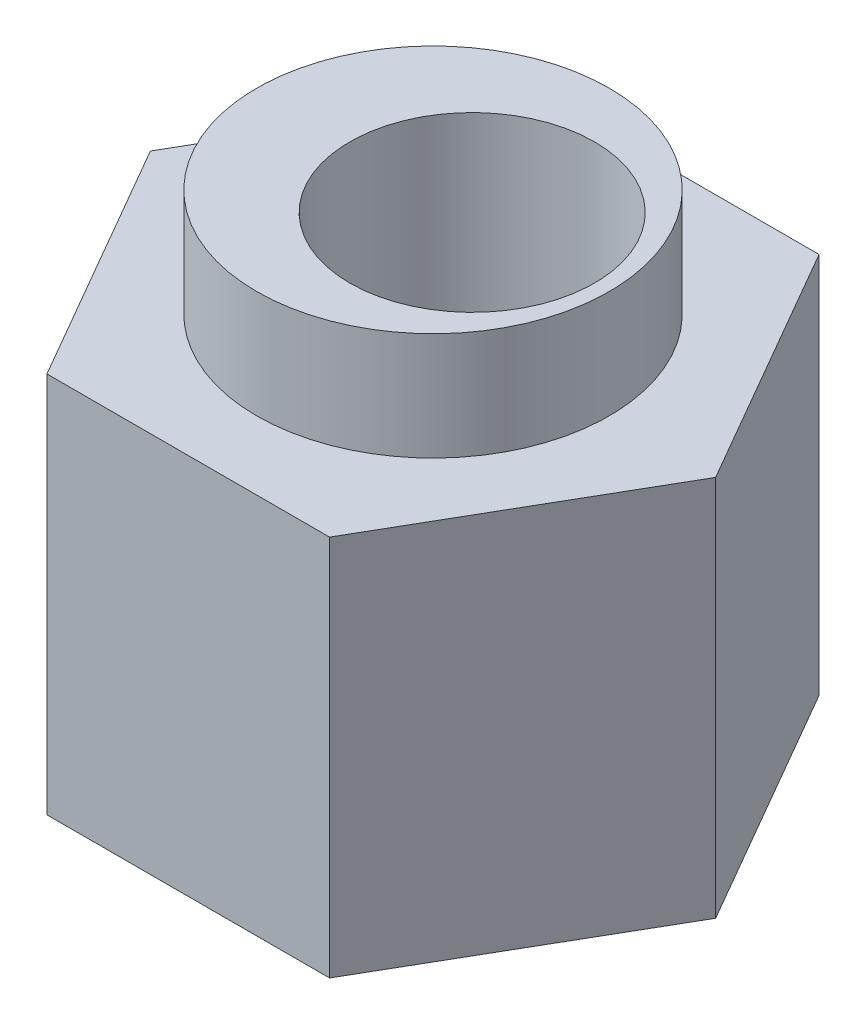
ISO-10303-21;
HEADER;
FILE_DESCRIPTION(('STEP AP214'),'2;1');
FILE_NAME('part.step','',(''),(''),'','','');
FILE_SCHEMA(('AUTOMOTIVE_DESIGN { 1 0 10303 214 1 1 1 1 }'));
ENDSEC;
DATA;
#1=APPLICATION_CONTEXT('core data for automotive mechanical design processes');
#2=APPLICATION_PROTOCOL_DEFINITION('international standard','automotive_design',2000,#1);
#3=PRODUCT_CONTEXT('',#1,'mechanical');
#4=PRODUCT('Part','Part','',(#3));
#5=PRODUCT_RELATED_PRODUCT_CATEGORY('part','',(#4));
#6=PRODUCT_DEFINITION_FORMATION('','',#4);
#7=PRODUCT_DEFINITION_CONTEXT('part definition',#1,'design');
#8=PRODUCT_DEFINITION('design','',#6,#7);
#9=PRODUCT_DEFINITION_SHAPE('','',#8);
#10=(LENGTH_UNIT() NAMED_UNIT(*) SI_UNIT(.MILLI.,.METRE.));
#11=(NAMED_UNIT(*) PLANE_ANGLE_UNIT() SI_UNIT($,.RADIAN.));
#12=(NAMED_UNIT(*) SI_UNIT($,.STERADIAN.) SOLID_ANGLE_UNIT());
#13=UNCERTAINTY_MEASURE_WITH_UNIT(LENGTH_MEASURE(1.E-05),#10,'distance_accuracy_value','');
#14=(GEOMETRIC_REPRESENTATION_CONTEXT(3) GLOBAL_UNCERTAINTY_ASSIGNED_CONTEXT((#13)) GLOBAL_UNIT_ASSIGNED_CONTEXT((#10,
#11,#12)) REPRESENTATION_CONTEXT('',''));
#15=CARTESIAN_POINT('',(0.,0.,0.));
#16=DIRECTION('',(0.,0.,1.));
#17=DIRECTION('',(1.,0.,0.));
#18=AXIS2_PLACEMENT_3D('',#15,#16,#17);
#19=CARTESIAN_POINT('',(2.88675134594813,7.8,5.00000000000001));
#20=DIRECTION('',(-0.866025403784439,0.,-0.5));
#21=DIRECTION('',(-0.5,0.,0.866025403784439));
#22=AXIS2_PLACEMENT_3D('',#19,#20,#21);
#23=PLANE('',#22);
#24=DIRECTION('',(0.5,0.,-0.866025403784439));
#25=VECTOR('',#24,1.);
#26=CARTESIAN_POINT('',(2.88675134594813,0.,5.00000000000001));
#27=LINE('',#26,#25);
#28=CARTESIAN_POINT('',(2.88675134594813,0.,5.00000000000001));
#29=VERTEX_POINT('',#28);
#30=CARTESIAN_POINT('',(5.77350269189626,0.,0.));
#31=VERTEX_POINT('',#30);
#32=EDGE_CURVE('E117',#29,#31,#27,.T.);
#33=ORIENTED_EDGE('',*,*,#32,.T.);
#34=DIRECTION('',(0.,-1.,0.));
#35=VECTOR('',#34,1.);
#36=CARTESIAN_POINT('',(5.77350269189626,7.8,0.));
#37=LINE('',#36,#35);
#38=CARTESIAN_POINT('',(5.77350269189626,7.8,0.));
#39=VERTEX_POINT('',#38);
#40=EDGE_CURVE('E40',#39,#31,#37,.T.);
#41=ORIENTED_EDGE('',*,*,#40,.F.);
#42=DIRECTION('',(0.5,0.,-0.866025403784439));
#43=VECTOR('',#42,1.);
#44=CARTESIAN_POINT('',(2.88675134594813,7.8,5.00000000000001));
#45=LINE('',#44,#43);
#46=CARTESIAN_POINT('',(2.88675134594813,7.8,5.00000000000001));
#47=VERTEX_POINT('',#46);
#48=EDGE_CURVE('E128',#47,#39,#45,.T.);
#49=ORIENTED_EDGE('',*,*,#48,.F.);
#50=DIRECTION('',(0.,-1.,0.));
#51=VECTOR('',#50,1.);
#52=CARTESIAN_POINT('',(2.88675134594813,7.8,5.00000000000001));
#53=LINE('',#52,#51);
#54=EDGE_CURVE('E113',#47,#29,#53,.T.);
#55=ORIENTED_EDGE('',*,*,#54,.T.);
#56=EDGE_LOOP('',(#33,#41,#49,#55));
#57=FACE_BOUND('',#56,.T.);
#58=ADVANCED_FACE('F32',(#57),#23,.F.);
#59=CARTESIAN_POINT('',(5.77350269189626,7.8,0.));
#60=DIRECTION('',(-0.866025403784439,0.,0.5));
#61=DIRECTION('',(0.5,0.,0.866025403784439));
#62=AXIS2_PLACEMENT_3D('',#59,#60,#61);
#63=PLANE('',#62);
#64=DIRECTION('',(-0.5,0.,-0.866025403784439));
#65=VECTOR('',#64,1.);
#66=CARTESIAN_POINT('',(5.77350269189626,0.,0.));
#67=LINE('',#66,#65);
#68=CARTESIAN_POINT('',(2.88675134594813,0.,-5.00000000000001));
#69=VERTEX_POINT('',#68);
#70=EDGE_CURVE('E120',#31,#69,#67,.T.);
#71=ORIENTED_EDGE('',*,*,#70,.T.);
#72=DIRECTION('',(0.,-1.,0.));
#73=VECTOR('',#72,1.);
#74=CARTESIAN_POINT('',(2.88675134594813,7.8,-5.00000000000001));
#75=LINE('',#74,#73);
#76=CARTESIAN_POINT('',(2.88675134594813,7.8,-5.00000000000001));
#77=VERTEX_POINT('',#76);
#78=EDGE_CURVE('E132',#77,#69,#75,.T.);
#79=ORIENTED_EDGE('',*,*,#78,.F.);
#80=DIRECTION('',(-0.5,0.,-0.866025403784439));
#81=VECTOR('',#80,1.);
#82=CARTESIAN_POINT('',(5.77350269189626,7.8,0.));
#83=LINE('',#82,#81);
#84=EDGE_CURVE('E86',#39,#77,#83,.T.);
#85=ORIENTED_EDGE('',*,*,#84,.F.);
#86=ORIENTED_EDGE('',*,*,#40,.T.);
#87=EDGE_LOOP('',(#71,#79,#85,#86));
#88=FACE_BOUND('',#87,.T.);
#89=ADVANCED_FACE('F135',(#88),#63,.F.);
#90=CARTESIAN_POINT('',(2.88675134594813,7.8,-5.00000000000001));
#91=DIRECTION('',(0.,0.,1.));
#92=DIRECTION('',(1.,0.,0.));
#93=AXIS2_PLACEMENT_3D('',#90,#91,#92);
#94=PLANE('',#93);
#95=DIRECTION('',(-1.,0.,0.));
#96=VECTOR('',#95,1.);
#97=CARTESIAN_POINT('',(2.88675134594813,0.,-5.00000000000001));
#98=LINE('',#97,#96);
#99=CARTESIAN_POINT('',(-2.88675134594813,0.,-5.00000000000001));
#100=VERTEX_POINT('',#99);
#101=EDGE_CURVE('E123',#69,#100,#98,.T.);
#102=ORIENTED_EDGE('',*,*,#101,.T.);
#103=DIRECTION('',(0.,-1.,0.));
#104=VECTOR('',#103,1.);
#105=CARTESIAN_POINT('',(-2.88675134594813,7.8,-5.00000000000001));
#106=LINE('',#105,#104);
#107=CARTESIAN_POINT('',(-2.88675134594813,7.8,-5.00000000000001));
#108=VERTEX_POINT('',#107);
#109=EDGE_CURVE('E108',#108,#100,#106,.T.);
#110=ORIENTED_EDGE('',*,*,#109,.F.);
#111=DIRECTION('',(-1.,0.,0.));
#112=VECTOR('',#111,1.);
#113=CARTESIAN_POINT('',(2.88675134594813,7.8,-5.00000000000001));
#114=LINE('',#113,#112);
#115=EDGE_CURVE('E99',#77,#108,#114,.T.);
#116=ORIENTED_EDGE('',*,*,#115,.F.);
#117=ORIENTED_EDGE('',*,*,#78,.T.);
#118=EDGE_LOOP('',(#102,#110,#116,#117));
#119=FACE_BOUND('',#118,.T.);
#120=ADVANCED_FACE('F143',(#119),#94,.F.);
#121=CARTESIAN_POINT('',(-2.88675134594813,7.8,-5.00000000000001));
#122=DIRECTION('',(0.866025403784439,0.,0.5));
#123=DIRECTION('',(0.5,0.,-0.866025403784439));
#124=AXIS2_PLACEMENT_3D('',#121,#122,#123);
#125=PLANE('',#124);
#126=DIRECTION('',(-0.5,0.,0.866025403784439));
#127=VECTOR('',#126,1.);
#128=CARTESIAN_POINT('',(-2.88675134594813,0.,-5.00000000000001));
#129=LINE('',#128,#127);
#130=CARTESIAN_POINT('',(-5.77350269189626,0.,0.));
#131=VERTEX_POINT('',#130);
#132=EDGE_CURVE('E107',#100,#131,#129,.T.);
#133=ORIENTED_EDGE('',*,*,#132,.T.);
#134=DIRECTION('',(0.,-1.,0.));
#135=VECTOR('',#134,1.);
#136=CARTESIAN_POINT('',(-5.77350269189626,7.8,0.));
#137=LINE('',#136,#135);
#138=CARTESIAN_POINT('',(-5.77350269189626,7.8,0.));
#139=VERTEX_POINT('',#138);
#140=EDGE_CURVE('E104',#139,#131,#137,.T.);
#141=ORIENTED_EDGE('',*,*,#140,.F.);
#142=DIRECTION('',(-0.5,0.,0.866025403784439));
#143=VECTOR('',#142,1.);
#144=CARTESIAN_POINT('',(-2.88675134594813,7.8,-5.00000000000001));
#145=LINE('',#144,#143);
#146=EDGE_CURVE('E93',#108,#139,#145,.T.);
#147=ORIENTED_EDGE('',*,*,#146,.F.);
#148=ORIENTED_EDGE('',*,*,#109,.T.);
#149=EDGE_LOOP('',(#133,#141,#147,#148));
#150=FACE_BOUND('',#149,.T.);
#151=ADVANCED_FACE('F105',(#150),#125,.F.);
#152=CARTESIAN_POINT('',(-5.77350269189626,7.8,0.));
#153=DIRECTION('',(0.866025403784439,0.,-0.5));
#154=DIRECTION('',(-0.5,0.,-0.866025403784439));
#155=AXIS2_PLACEMENT_3D('',#152,#153,#154);
#156=PLANE('',#155);
#157=DIRECTION('',(0.5,0.,0.866025403784439));
#158=VECTOR('',#157,1.);
#159=CARTESIAN_POINT('',(-5.77350269189626,0.,0.));
#160=LINE('',#159,#158);
#161=CARTESIAN_POINT('',(-2.88675134594813,0.,5.00000000000001));
#162=VERTEX_POINT('',#161);
#163=EDGE_CURVE('E71',#131,#162,#160,.T.);
#164=ORIENTED_EDGE('',*,*,#163,.T.);
#165=DIRECTION('',(0.,-1.,0.));
#166=VECTOR('',#165,1.);
#167=CARTESIAN_POINT('',(-2.88675134594813,7.8,5.00000000000001));
#168=LINE('',#167,#166);
#169=CARTESIAN_POINT('',(-2.88675134594813,7.8,5.00000000000001));
#170=VERTEX_POINT('',#169);
#171=EDGE_CURVE('E109',#170,#162,#168,.T.);
#172=ORIENTED_EDGE('',*,*,#171,.F.);
#173=DIRECTION('',(0.5,0.,0.866025403784439));
#174=VECTOR('',#173,1.);
#175=CARTESIAN_POINT('',(-5.77350269189626,7.8,0.));
#176=LINE('',#175,#174);
#177=EDGE_CURVE('E97',#139,#170,#176,.T.);
#178=ORIENTED_EDGE('',*,*,#177,.F.);
#179=ORIENTED_EDGE('',*,*,#140,.T.);
#180=EDGE_LOOP('',(#164,#172,#178,#179));
#181=FACE_BOUND('',#180,.T.);
#182=ADVANCED_FACE('F111',(#181),#156,.F.);
#183=CARTESIAN_POINT('',(-2.88675134594813,7.8,5.00000000000001));
#184=DIRECTION('',(0.,0.,-1.));
#185=DIRECTION('',(-1.,0.,0.));
#186=AXIS2_PLACEMENT_3D('',#183,#184,#185);
#187=PLANE('',#186);
#188=DIRECTION('',(1.,0.,0.));
#189=VECTOR('',#188,1.);
#190=CARTESIAN_POINT('',(-2.88675134594813,0.,5.00000000000001));
#191=LINE('',#190,#189);
#192=EDGE_CURVE('E77',#162,#29,#191,.T.);
#193=ORIENTED_EDGE('',*,*,#192,.T.);
#194=ORIENTED_EDGE('',*,*,#54,.F.);
#195=DIRECTION('',(1.,0.,0.));
#196=VECTOR('',#195,1.);
#197=CARTESIAN_POINT('',(-2.88675134594813,7.8,5.00000000000001));
#198=LINE('',#197,#196);
#199=EDGE_CURVE('E48',#170,#47,#198,.T.);
#200=ORIENTED_EDGE('',*,*,#199,.F.);
#201=ORIENTED_EDGE('',*,*,#171,.T.);
#202=EDGE_LOOP('',(#193,#194,#200,#201));
#203=FACE_BOUND('',#202,.T.);
#204=ADVANCED_FACE('F178',(#203),#187,.F.);
#205=CARTESIAN_POINT('',(0.,7.8,0.));
#206=DIRECTION('',(0.,1.,0.));
#207=DIRECTION('',(0.,0.,1.));
#208=AXIS2_PLACEMENT_3D('',#205,#206,#207);
#209=PLANE('',#208);
#210=CARTESIAN_POINT('',(0.,7.8,0.));
#211=DIRECTION('',(0.,1.,0.));
#212=DIRECTION('',(0.,0.,1.));
#213=AXIS2_PLACEMENT_3D('',#210,#211,#212);
#214=CIRCLE('',#213,3.6);
#215=CARTESIAN_POINT('',(0.,7.8,3.6));
#216=VERTEX_POINT('',#215);
#217=EDGE_CURVE('E147',#216,#216,#214,.T.);
#218=ORIENTED_EDGE('',*,*,#217,.F.);
#219=EDGE_LOOP('',(#218));
#220=FACE_BOUND('',#219,.T.);
#221=ORIENTED_EDGE('',*,*,#48,.T.);
#222=ORIENTED_EDGE('',*,*,#84,.T.);
#223=ORIENTED_EDGE('',*,*,#115,.T.);
#224=ORIENTED_EDGE('',*,*,#146,.T.);
#225=ORIENTED_EDGE('',*,*,#177,.T.);
#226=ORIENTED_EDGE('',*,*,#199,.T.);
#227=EDGE_LOOP('',(#221,#222,#223,#224,#225,#226));
#228=FACE_BOUND('',#227,.T.);
#229=ADVANCED_FACE('F95',(#220,#228),#209,.T.);
#230=CARTESIAN_POINT('',(0.,0.,0.));
#231=DIRECTION('',(0.,1.,0.));
#232=DIRECTION('',(0.,0.,1.));
#233=AXIS2_PLACEMENT_3D('',#230,#231,#232);
#234=PLANE('',#233);
#235=CARTESIAN_POINT('',(0.,0.,0.));
#236=DIRECTION('',(0.,1.,0.));
#237=DIRECTION('',(0.,0.,1.));
#238=AXIS2_PLACEMENT_3D('',#235,#236,#237);
#239=CIRCLE('',#238,3.6);
#240=CARTESIAN_POINT('',(0.,0.,3.6));
#241=VERTEX_POINT('',#240);
#242=EDGE_CURVE('E11',#241,#241,#239,.F.);
#243=ORIENTED_EDGE('',*,*,#242,.F.);
#244=EDGE_LOOP('',(#243));
#245=FACE_BOUND('',#244,.T.);
#246=ORIENTED_EDGE('',*,*,#32,.F.);
#247=ORIENTED_EDGE('',*,*,#192,.F.);
#248=ORIENTED_EDGE('',*,*,#163,.F.);
#249=ORIENTED_EDGE('',*,*,#132,.F.);
#250=ORIENTED_EDGE('',*,*,#101,.F.);
#251=ORIENTED_EDGE('',*,*,#70,.F.);
#252=EDGE_LOOP('',(#246,#247,#248,#249,#250,#251));
#253=FACE_BOUND('',#252,.T.);
#254=ADVANCED_FACE('F140',(#245,#253),#234,.F.);
#255=CARTESIAN_POINT('',(0.,10.,0.));
#256=DIRECTION('',(0.,-1.,0.));
#257=DIRECTION('',(0.,0.,-1.));
#258=AXIS2_PLACEMENT_3D('',#255,#256,#257);
#259=CYLINDRICAL_SURFACE('',#258,3.6);
#260=CARTESIAN_POINT('',(0.,10.,0.));
#261=DIRECTION('',(0.,1.,0.));
#262=DIRECTION('',(0.,0.,1.));
#263=AXIS2_PLACEMENT_3D('',#260,#261,#262);
#264=CIRCLE('',#263,3.6);
#265=CARTESIAN_POINT('',(0.,10.,3.6));
#266=VERTEX_POINT('',#265);
#267=EDGE_CURVE('E121',#266,#266,#264,.T.);
#268=ORIENTED_EDGE('',*,*,#267,.F.);
#269=EDGE_LOOP('',(#268));
#270=FACE_BOUND('',#269,.T.);
#271=ORIENTED_EDGE('',*,*,#217,.T.);
#272=EDGE_LOOP('',(#271));
#273=FACE_BOUND('',#272,.T.);
#274=ADVANCED_FACE('F168',(#270,#273),#259,.T.);
#275=CARTESIAN_POINT('',(0.,10.,0.));
#276=DIRECTION('',(0.,1.,0.));
#277=DIRECTION('',(0.,0.,1.));
#278=AXIS2_PLACEMENT_3D('',#275,#276,#277);
#279=PLANE('',#278);
#280=CARTESIAN_POINT('',(0.8,10.,0.));
#281=DIRECTION('',(0.,1.,0.));
#282=DIRECTION('',(0.,0.,1.));
#283=AXIS2_PLACEMENT_3D('',#280,#281,#282);
#284=CIRCLE('',#283,2.5);
#285=CARTESIAN_POINT('',(0.8,10.,2.5));
#286=VERTEX_POINT('',#285);
#287=EDGE_CURVE('E158',#286,#286,#284,.T.);
#288=ORIENTED_EDGE('',*,*,#287,.F.);
#289=EDGE_LOOP('',(#288));
#290=FACE_BOUND('',#289,.T.);
#291=ORIENTED_EDGE('',*,*,#267,.T.);
#292=EDGE_LOOP('',(#291));
#293=FACE_BOUND('',#292,.T.);
#294=ADVANCED_FACE('F164',(#290,#293),#279,.T.);
#295=CARTESIAN_POINT('',(0.,-0.4,0.));
#296=DIRECTION('',(0.,1.,0.));
#297=DIRECTION('',(0.,0.,1.));
#298=AXIS2_PLACEMENT_3D('',#295,#296,#297);
#299=CYLINDRICAL_SURFACE('',#298,3.6);
#300=CARTESIAN_POINT('',(0.,-0.4,0.));
#301=DIRECTION('',(0.,-1.,0.));
#302=DIRECTION('',(0.,0.,-1.));
#303=AXIS2_PLACEMENT_3D('',#300,#301,#302);
#304=CIRCLE('',#303,3.6);
#305=CARTESIAN_POINT('',(0.,-0.4,-3.6));
#306=VERTEX_POINT('',#305);
#307=EDGE_CURVE('E150',#306,#306,#304,.T.);
#308=ORIENTED_EDGE('',*,*,#307,.F.);
#309=EDGE_LOOP('',(#308));
#310=FACE_BOUND('',#309,.T.);
#311=ORIENTED_EDGE('',*,*,#242,.T.);
#312=EDGE_LOOP('',(#311));
#313=FACE_BOUND('',#312,.T.);
#314=ADVANCED_FACE('F167',(#310,#313),#299,.T.);
#315=CARTESIAN_POINT('',(0.,-0.4,0.));
#316=DIRECTION('',(0.,-1.,0.));
#317=DIRECTION('',(0.,0.,-1.));
#318=AXIS2_PLACEMENT_3D('',#315,#316,#317);
#319=PLANE('',#318);
#320=CARTESIAN_POINT('',(0.8,-0.4,0.));
#321=DIRECTION('',(0.,1.,0.));
#322=DIRECTION('',(0.,0.,1.));
#323=AXIS2_PLACEMENT_3D('',#320,#321,#322);
#324=CIRCLE('',#323,2.5);
#325=CARTESIAN_POINT('',(0.8,-0.4,2.5));
#326=VERTEX_POINT('',#325);
#327=EDGE_CURVE('E155',#326,#326,#324,.T.);
#328=ORIENTED_EDGE('',*,*,#327,.T.);
#329=EDGE_LOOP('',(#328));
#330=FACE_BOUND('',#329,.T.);
#331=ORIENTED_EDGE('',*,*,#307,.T.);
#332=EDGE_LOOP('',(#331));
#333=FACE_BOUND('',#332,.T.);
#334=ADVANCED_FACE('F233',(#330,#333),#319,.T.);
#335=CARTESIAN_POINT('',(0.8,-0.4,0.));
#336=DIRECTION('',(0.,1.,0.));
#337=DIRECTION('',(0.,0.,1.));
#338=AXIS2_PLACEMENT_3D('',#335,#336,#337);
#339=CYLINDRICAL_SURFACE('',#338,2.5);
#340=ORIENTED_EDGE('',*,*,#327,.F.);
#341=EDGE_LOOP('',(#340));
#342=FACE_BOUND('',#341,.T.);
#343=ORIENTED_EDGE('',*,*,#287,.T.);
#344=EDGE_LOOP('',(#343));
#345=FACE_BOUND('',#344,.T.);
#346=ADVANCED_FACE('F162',(#342,#345),#339,.F.);
#347=CLOSED_SHELL('',(#58,#89,#120,#151,#182,#204,#229,#254,#274,#294,#314,#334,#346));
#348=MANIFOLD_SOLID_BREP('B2',#347);
#349=ADVANCED_BREP_SHAPE_REPRESENTATION('',(#18,#348),#14);
#350=SHAPE_DEFINITION_REPRESENTATION(#9,#349);
ENDSEC;
END-ISO-10303-21;
